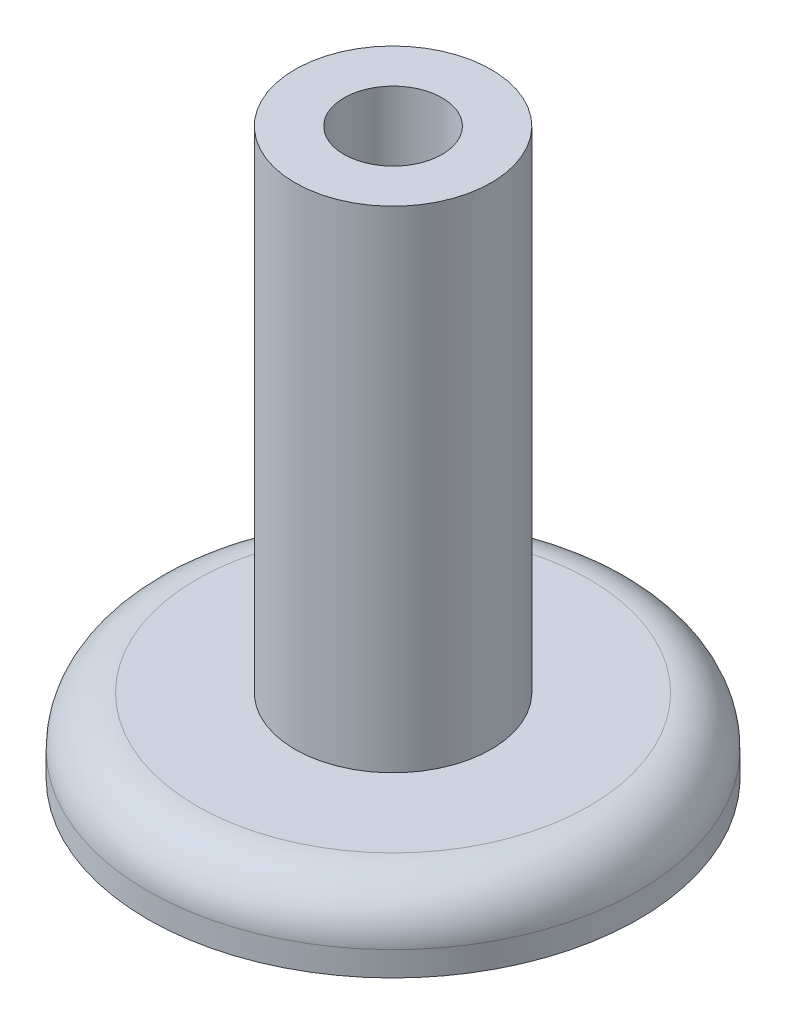
ISO-10303-21;
HEADER;
FILE_DESCRIPTION(('STEP AP214'),'2;1');
FILE_NAME('part.step','',(''),(''),'','','');
FILE_SCHEMA(('AUTOMOTIVE_DESIGN { 1 0 10303 214 1 1 1 1 }'));
ENDSEC;
DATA;
#1=APPLICATION_CONTEXT('core data for automotive mechanical design processes');
#2=APPLICATION_PROTOCOL_DEFINITION('international standard','automotive_design',2000,#1);
#3=PRODUCT_CONTEXT('',#1,'mechanical');
#4=PRODUCT('Part','Part','',(#3));
#5=PRODUCT_RELATED_PRODUCT_CATEGORY('part','',(#4));
#6=PRODUCT_DEFINITION_FORMATION('','',#4);
#7=PRODUCT_DEFINITION_CONTEXT('part definition',#1,'design');
#8=PRODUCT_DEFINITION('design','',#6,#7);
#9=PRODUCT_DEFINITION_SHAPE('','',#8);
#10=(LENGTH_UNIT() NAMED_UNIT(*) SI_UNIT(.MILLI.,.METRE.));
#11=(NAMED_UNIT(*) PLANE_ANGLE_UNIT() SI_UNIT($,.RADIAN.));
#12=(NAMED_UNIT(*) SI_UNIT($,.STERADIAN.) SOLID_ANGLE_UNIT());
#13=UNCERTAINTY_MEASURE_WITH_UNIT(LENGTH_MEASURE(1.E-05),#10,'distance_accuracy_value','');
#14=(GEOMETRIC_REPRESENTATION_CONTEXT(3) GLOBAL_UNCERTAINTY_ASSIGNED_CONTEXT((#13)) GLOBAL_UNIT_ASSIGNED_CONTEXT((#10,
#11,#12)) REPRESENTATION_CONTEXT('',''));
#15=CARTESIAN_POINT('',(0.,0.,0.));
#16=DIRECTION('',(0.,0.,1.));
#17=DIRECTION('',(1.,0.,0.));
#18=AXIS2_PLACEMENT_3D('',#15,#16,#17);
#19=CARTESIAN_POINT('',(0.,1.5,0.));
#20=DIRECTION('',(0.,1.,0.));
#21=DIRECTION('',(0.,0.,1.));
#22=AXIS2_PLACEMENT_3D('',#19,#20,#21);
#23=PLANE('',#22);
#24=CARTESIAN_POINT('',(0.,1.5,0.));
#25=DIRECTION('',(0.,1.,0.));
#26=DIRECTION('',(0.,0.,1.));
#27=AXIS2_PLACEMENT_3D('',#24,#25,#26);
#28=CIRCLE('',#27,4.);
#29=CARTESIAN_POINT('',(0.,1.5,4.));
#30=VERTEX_POINT('',#29);
#31=EDGE_CURVE('E40',#30,#30,#28,.T.);
#32=ORIENTED_EDGE('',*,*,#31,.T.);
#33=EDGE_LOOP('',(#32));
#34=FACE_BOUND('',#33,.T.);
#35=CARTESIAN_POINT('',(0.,1.5,0.));
#36=DIRECTION('',(0.,1.,0.));
#37=DIRECTION('',(0.,0.,1.));
#38=AXIS2_PLACEMENT_3D('',#35,#36,#37);
#39=CIRCLE('',#38,2.);
#40=CARTESIAN_POINT('',(0.,1.5,2.));
#41=VERTEX_POINT('',#40);
#42=EDGE_CURVE('E54',#41,#41,#39,.T.);
#43=ORIENTED_EDGE('',*,*,#42,.F.);
#44=EDGE_LOOP('',(#43));
#45=FACE_BOUND('',#44,.T.);
#46=ADVANCED_FACE('F33',(#34,#45),#23,.T.);
#47=CARTESIAN_POINT('',(0.,0.,0.));
#48=DIRECTION('',(0.,1.,0.));
#49=DIRECTION('',(0.,0.,1.));
#50=AXIS2_PLACEMENT_3D('',#47,#48,#49);
#51=PLANE('',#50);
#52=CARTESIAN_POINT('',(0.,0.,0.));
#53=DIRECTION('',(0.,1.,0.));
#54=DIRECTION('',(0.,0.,1.));
#55=AXIS2_PLACEMENT_3D('',#52,#53,#54);
#56=CIRCLE('',#55,5.);
#57=CARTESIAN_POINT('',(0.,0.,5.));
#58=VERTEX_POINT('',#57);
#59=EDGE_CURVE('E44',#58,#58,#56,.T.);
#60=ORIENTED_EDGE('',*,*,#59,.F.);
#61=EDGE_LOOP('',(#60));
#62=FACE_BOUND('',#61,.T.);
#63=CARTESIAN_POINT('',(0.,0.,0.));
#64=DIRECTION('',(0.,1.,0.));
#65=DIRECTION('',(0.,0.,1.));
#66=AXIS2_PLACEMENT_3D('',#63,#64,#65);
#67=CIRCLE('',#66,1.);
#68=CARTESIAN_POINT('',(0.,0.,1.));
#69=VERTEX_POINT('',#68);
#70=EDGE_CURVE('E48',#69,#69,#67,.T.);
#71=ORIENTED_EDGE('',*,*,#70,.T.);
#72=EDGE_LOOP('',(#71));
#73=FACE_BOUND('',#72,.T.);
#74=ADVANCED_FACE('F78',(#62,#73),#51,.F.);
#75=CARTESIAN_POINT('',(0.,1.5,0.));
#76=DIRECTION('',(0.,-1.,0.));
#77=DIRECTION('',(0.,0.,-1.));
#78=AXIS2_PLACEMENT_3D('',#75,#76,#77);
#79=CYLINDRICAL_SURFACE('',#78,5.);
#80=CARTESIAN_POINT('',(0.,0.5,0.));
#81=DIRECTION('',(0.,1.,0.));
#82=DIRECTION('',(0.,0.,1.));
#83=AXIS2_PLACEMENT_3D('',#80,#81,#82);
#84=CIRCLE('',#83,5.);
#85=CARTESIAN_POINT('',(0.,0.5,5.));
#86=VERTEX_POINT('',#85);
#87=EDGE_CURVE('E10',#86,#86,#84,.F.);
#88=ORIENTED_EDGE('',*,*,#87,.T.);
#89=EDGE_LOOP('',(#88));
#90=FACE_BOUND('',#89,.T.);
#91=ORIENTED_EDGE('',*,*,#59,.T.);
#92=EDGE_LOOP('',(#91));
#93=FACE_BOUND('',#92,.T.);
#94=ADVANCED_FACE('F83',(#90,#93),#79,.T.);
#95=CARTESIAN_POINT('',(0.,1.5,0.));
#96=DIRECTION('',(0.,-1.,0.));
#97=DIRECTION('',(0.,0.,-1.));
#98=AXIS2_PLACEMENT_3D('',#95,#96,#97);
#99=CYLINDRICAL_SURFACE('',#98,1.);
#100=ORIENTED_EDGE('',*,*,#70,.F.);
#101=EDGE_LOOP('',(#100));
#102=FACE_BOUND('',#101,.T.);
#103=CARTESIAN_POINT('',(0.,11.5,0.));
#104=DIRECTION('',(0.,1.,0.));
#105=DIRECTION('',(0.,0.,1.));
#106=AXIS2_PLACEMENT_3D('',#103,#104,#105);
#107=CIRCLE('',#106,1.);
#108=CARTESIAN_POINT('',(0.,11.5,1.));
#109=VERTEX_POINT('',#108);
#110=EDGE_CURVE('E57',#109,#109,#107,.T.);
#111=ORIENTED_EDGE('',*,*,#110,.T.);
#112=EDGE_LOOP('',(#111));
#113=FACE_BOUND('',#112,.T.);
#114=ADVANCED_FACE('F63',(#102,#113),#99,.F.);
#115=CARTESIAN_POINT('',(0.,0.5,0.));
#116=DIRECTION('',(0.,1.,0.));
#117=DIRECTION('',(0.,0.,1.));
#118=AXIS2_PLACEMENT_3D('',#115,#116,#117);
#119=TOROIDAL_SURFACE('',#118,4.,1.);
#120=ORIENTED_EDGE('',*,*,#87,.F.);
#121=EDGE_LOOP('',(#120));
#122=FACE_BOUND('',#121,.T.);
#123=ORIENTED_EDGE('',*,*,#31,.F.);
#124=EDGE_LOOP('',(#123));
#125=FACE_BOUND('',#124,.T.);
#126=ADVANCED_FACE('F35',(#122,#125),#119,.T.);
#127=CARTESIAN_POINT('',(0.,11.5,0.));
#128=DIRECTION('',(0.,1.,0.));
#129=DIRECTION('',(0.,0.,1.));
#130=AXIS2_PLACEMENT_3D('',#127,#128,#129);
#131=PLANE('',#130);
#132=CARTESIAN_POINT('',(0.,11.5,0.));
#133=DIRECTION('',(0.,1.,0.));
#134=DIRECTION('',(0.,0.,1.));
#135=AXIS2_PLACEMENT_3D('',#132,#133,#134);
#136=CIRCLE('',#135,2.);
#137=CARTESIAN_POINT('',(0.,11.5,2.));
#138=VERTEX_POINT('',#137);
#139=EDGE_CURVE('E53',#138,#138,#136,.T.);
#140=ORIENTED_EDGE('',*,*,#139,.T.);
#141=EDGE_LOOP('',(#140));
#142=FACE_BOUND('',#141,.T.);
#143=ORIENTED_EDGE('',*,*,#110,.F.);
#144=EDGE_LOOP('',(#143));
#145=FACE_BOUND('',#144,.T.);
#146=ADVANCED_FACE('F65',(#142,#145),#131,.T.);
#147=CARTESIAN_POINT('',(0.,11.5,0.));
#148=DIRECTION('',(0.,-1.,0.));
#149=DIRECTION('',(0.,0.,-1.));
#150=AXIS2_PLACEMENT_3D('',#147,#148,#149);
#151=CYLINDRICAL_SURFACE('',#150,2.);
#152=ORIENTED_EDGE('',*,*,#139,.F.);
#153=EDGE_LOOP('',(#152));
#154=FACE_BOUND('',#153,.T.);
#155=ORIENTED_EDGE('',*,*,#42,.T.);
#156=EDGE_LOOP('',(#155));
#157=FACE_BOUND('',#156,.T.);
#158=ADVANCED_FACE('F67',(#154,#157),#151,.T.);
#159=CLOSED_SHELL('',(#46,#74,#94,#114,#126,#146,#158));
#160=MANIFOLD_SOLID_BREP('B2',#159);
#161=ADVANCED_BREP_SHAPE_REPRESENTATION('',(#18,#160),#14);
#162=SHAPE_DEFINITION_REPRESENTATION(#9,#161);
ENDSEC;
END-ISO-10303-21;
